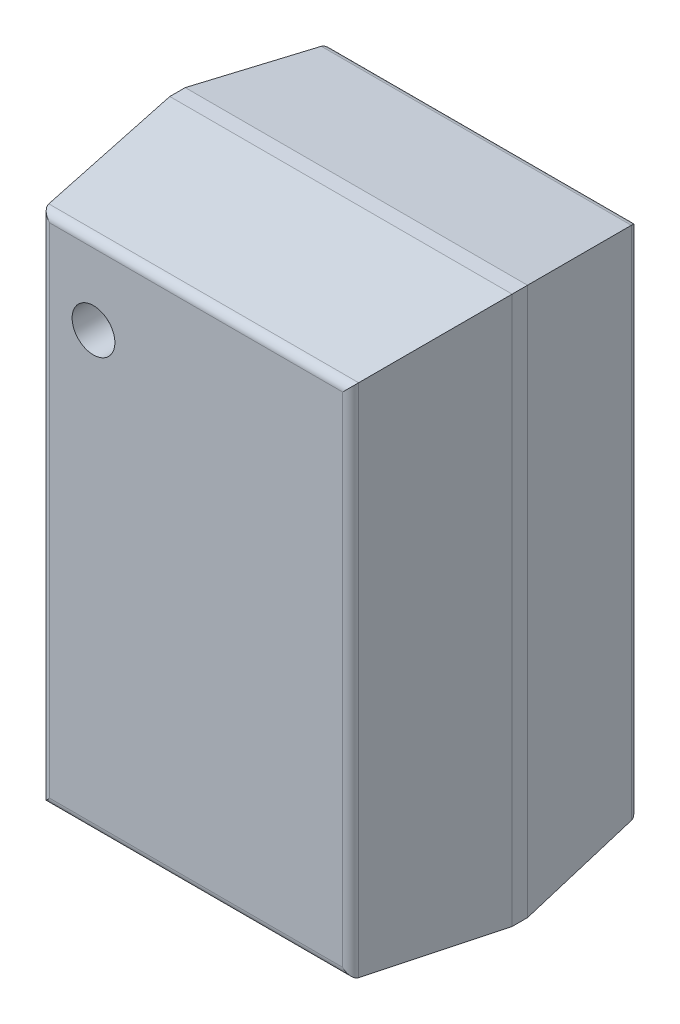
ISO-10303-21;
HEADER;
FILE_DESCRIPTION(('STEP AP214'),'2;1');
FILE_NAME('part.step','',(''),(''),'','','');
FILE_SCHEMA(('AUTOMOTIVE_DESIGN { 1 0 10303 214 1 1 1 1 }'));
ENDSEC;
DATA;
#1=APPLICATION_CONTEXT('core data for automotive mechanical design processes');
#2=APPLICATION_PROTOCOL_DEFINITION('international standard','automotive_design',2000,#1);
#3=PRODUCT_CONTEXT('',#1,'mechanical');
#4=PRODUCT('Part','Part','',(#3));
#5=PRODUCT_RELATED_PRODUCT_CATEGORY('part','',(#4));
#6=PRODUCT_DEFINITION_FORMATION('','',#4);
#7=PRODUCT_DEFINITION_CONTEXT('part definition',#1,'design');
#8=PRODUCT_DEFINITION('design','',#6,#7);
#9=PRODUCT_DEFINITION_SHAPE('','',#8);
#10=(LENGTH_UNIT() NAMED_UNIT(*) SI_UNIT(.MILLI.,.METRE.));
#11=(NAMED_UNIT(*) PLANE_ANGLE_UNIT() SI_UNIT($,.RADIAN.));
#12=(NAMED_UNIT(*) SI_UNIT($,.STERADIAN.) SOLID_ANGLE_UNIT());
#13=UNCERTAINTY_MEASURE_WITH_UNIT(LENGTH_MEASURE(1.E-05),#10,'distance_accuracy_value','');
#14=(GEOMETRIC_REPRESENTATION_CONTEXT(3) GLOBAL_UNCERTAINTY_ASSIGNED_CONTEXT((#13)) GLOBAL_UNIT_ASSIGNED_CONTEXT((#10,
#11,#12)) REPRESENTATION_CONTEXT('',''));
#15=CARTESIAN_POINT('',(0.,0.,0.));
#16=DIRECTION('',(0.,0.,1.));
#17=DIRECTION('',(1.,0.,0.));
#18=AXIS2_PLACEMENT_3D('',#15,#16,#17);
#19=CARTESIAN_POINT('',(-0.375,0.65,0.99));
#20=DIRECTION('',(0.,0.,1.));
#21=DIRECTION('',(1.,0.,0.));
#22=AXIS2_PLACEMENT_3D('',#19,#20,#21);
#23=PLANE('',#22);
#24=CARTESIAN_POINT('',(-0.375,0.65,0.99));
#25=DIRECTION('',(0.,0.,1.));
#26=DIRECTION('',(1.,0.,0.));
#27=AXIS2_PLACEMENT_3D('',#24,#25,#26);
#28=CIRCLE('',#27,0.078125);
#29=CARTESIAN_POINT('',(-0.296875,0.65,0.99));
#30=VERTEX_POINT('',#29);
#31=EDGE_CURVE('E20',#30,#30,#28,.T.);
#32=ORIENTED_EDGE('',*,*,#31,.T.);
#33=EDGE_LOOP('',(#32));
#34=FACE_BOUND('',#33,.T.);
#35=ADVANCED_FACE('F17',(#34),#23,.T.);
#36=CARTESIAN_POINT('',(-0.375,0.65,0.99));
#37=DIRECTION('',(0.,0.,1.));
#38=DIRECTION('',(1.,0.,0.));
#39=AXIS2_PLACEMENT_3D('',#36,#37,#38);
#40=CYLINDRICAL_SURFACE('',#39,0.078125);
#41=CARTESIAN_POINT('',(-0.375,0.65,1.1));
#42=DIRECTION('',(0.,0.,1.));
#43=DIRECTION('',(1.,0.,0.));
#44=AXIS2_PLACEMENT_3D('',#41,#42,#43);
#45=CIRCLE('',#44,0.078125);
#46=CARTESIAN_POINT('',(-0.296875,0.65,1.1));
#47=VERTEX_POINT('',#46);
#48=EDGE_CURVE('E100',#47,#47,#45,.F.);
#49=ORIENTED_EDGE('',*,*,#48,.F.);
#50=EDGE_LOOP('',(#49));
#51=FACE_BOUND('',#50,.T.);
#52=ORIENTED_EDGE('',*,*,#31,.F.);
#53=EDGE_LOOP('',(#52));
#54=FACE_BOUND('',#53,.T.);
#55=ADVANCED_FACE('F496',(#51,#54),#40,.F.);
#56=CARTESIAN_POINT('',(-0.625,-1.,1.1));
#57=DIRECTION('',(0.,0.,1.));
#58=DIRECTION('',(1.,0.,0.));
#59=AXIS2_PLACEMENT_3D('',#56,#57,#58);
#60=PLANE('',#59);
#61=ORIENTED_EDGE('',*,*,#48,.T.);
#62=EDGE_LOOP('',(#61));
#63=FACE_BOUND('',#62,.T.);
#64=DIRECTION('',(0.,1.,0.));
#65=VECTOR('',#64,1.);
#66=CARTESIAN_POINT('',(0.534726594457,-0.9375,1.1));
#67=LINE('',#66,#65);
#68=CARTESIAN_POINT('',(0.534726594457,0.909726594457,1.1));
#69=VERTEX_POINT('',#68);
#70=CARTESIAN_POINT('',(0.534726594457,-0.909726594457,1.1));
#71=VERTEX_POINT('',#70);
#72=EDGE_CURVE('E107',#69,#71,#67,.F.);
#73=ORIENTED_EDGE('',*,*,#72,.F.);
#74=DIRECTION('',(1.,0.,0.));
#75=VECTOR('',#74,1.);
#76=CARTESIAN_POINT('',(-0.625,0.909726594457,1.1));
#77=LINE('',#76,#75);
#78=CARTESIAN_POINT('',(-0.534726594457,0.909726594457,1.1));
#79=VERTEX_POINT('',#78);
#80=EDGE_CURVE('E96',#69,#79,#77,.F.);
#81=ORIENTED_EDGE('',*,*,#80,.T.);
#82=DIRECTION('',(0.,1.,0.));
#83=VECTOR('',#82,1.);
#84=CARTESIAN_POINT('',(-0.534726594457,-0.9375,1.1));
#85=LINE('',#84,#83);
#86=CARTESIAN_POINT('',(-0.534726594457,-0.909726594457,1.1));
#87=VERTEX_POINT('',#86);
#88=EDGE_CURVE('E92',#87,#79,#85,.T.);
#89=ORIENTED_EDGE('',*,*,#88,.F.);
#90=DIRECTION('',(1.,0.,0.));
#91=VECTOR('',#90,1.);
#92=CARTESIAN_POINT('',(-0.5625,-0.909726594457,1.1));
#93=LINE('',#92,#91);
#94=EDGE_CURVE('E81',#71,#87,#93,.F.);
#95=ORIENTED_EDGE('',*,*,#94,.F.);
#96=EDGE_LOOP('',(#73,#81,#89,#95));
#97=FACE_BOUND('',#96,.T.);
#98=ADVANCED_FACE('F95',(#63,#97),#60,.T.);
#99=CARTESIAN_POINT('',(-0.534726594457,-0.9375,1.06875));
#100=DIRECTION('',(0.,1.,0.));
#101=DIRECTION('',(0.,0.,1.));
#102=AXIS2_PLACEMENT_3D('',#99,#100,#101);
#103=CYLINDRICAL_SURFACE('',#102,0.03125);
#104=CARTESIAN_POINT('',(-0.534726594457,0.909726594457,1.06875));
#105=DIRECTION('',(0.707106781186547,0.707106781186547,0.));
#106=DIRECTION('',(0.707106781186547,-0.707106781186547,0.));
#107=AXIS2_PLACEMENT_3D('',#104,#105,#106);
#108=ELLIPSE('',#107,0.0441941738241592,0.03125);
#109=CARTESIAN_POINT('',(-0.565760504091001,0.940760504091001,1.07241864454874));
#110=VERTEX_POINT('',#109);
#111=EDGE_CURVE('E129',#110,#79,#108,.T.);
#112=ORIENTED_EDGE('',*,*,#111,.F.);
#113=DIRECTION('',(0.,1.,0.));
#114=VECTOR('',#113,1.);
#115=CARTESIAN_POINT('',(-0.565760504090913,-1.,1.07241864454899));
#116=LINE('',#115,#114);
#117=CARTESIAN_POINT('',(-0.565760504091001,-0.940760504091001,1.07241864454874));
#118=VERTEX_POINT('',#117);
#119=EDGE_CURVE('E104',#110,#118,#116,.F.);
#120=ORIENTED_EDGE('',*,*,#119,.T.);
#121=CARTESIAN_POINT('',(-0.534726594457,-0.909726594457,1.06875));
#122=DIRECTION('',(0.707106781186547,-0.707106781186547,0.));
#123=DIRECTION('',(0.707106781186547,0.707106781186547,0.));
#124=AXIS2_PLACEMENT_3D('',#121,#122,#123);
#125=ELLIPSE('',#124,0.0441941738241592,0.03125);
#126=EDGE_CURVE('E86',#87,#118,#125,.T.);
#127=ORIENTED_EDGE('',*,*,#126,.F.);
#128=ORIENTED_EDGE('',*,*,#88,.T.);
#129=EDGE_LOOP('',(#112,#120,#127,#128));
#130=FACE_BOUND('',#129,.T.);
#131=ADVANCED_FACE('F103',(#130),#103,.T.);
#132=CARTESIAN_POINT('',(-0.5625,-0.909726594457,1.06875));
#133=DIRECTION('',(1.,0.,0.));
#134=DIRECTION('',(0.,0.,-1.));
#135=AXIS2_PLACEMENT_3D('',#132,#133,#134);
#136=CYLINDRICAL_SURFACE('',#135,0.03125);
#137=ORIENTED_EDGE('',*,*,#94,.T.);
#138=ORIENTED_EDGE('',*,*,#126,.T.);
#139=DIRECTION('',(1.,0.,0.));
#140=VECTOR('',#139,1.);
#141=CARTESIAN_POINT('',(-0.625,-0.940760504090913,1.07241864454899));
#142=LINE('',#141,#140);
#143=CARTESIAN_POINT('',(0.565760504091001,-0.940760504091001,1.07241864454874));
#144=VERTEX_POINT('',#143);
#145=EDGE_CURVE('E141',#118,#144,#142,.T.);
#146=ORIENTED_EDGE('',*,*,#145,.T.);
#147=CARTESIAN_POINT('',(0.534726594457,-0.909726594457,1.06875));
#148=DIRECTION('',(0.707106781186547,0.707106781186547,0.));
#149=DIRECTION('',(-0.707106781186547,0.707106781186547,0.));
#150=AXIS2_PLACEMENT_3D('',#147,#148,#149);
#151=ELLIPSE('',#150,0.0441941738241592,0.03125);
#152=EDGE_CURVE('E88',#71,#144,#151,.T.);
#153=ORIENTED_EDGE('',*,*,#152,.F.);
#154=EDGE_LOOP('',(#137,#138,#146,#153));
#155=FACE_BOUND('',#154,.T.);
#156=ADVANCED_FACE('F83',(#155),#136,.T.);
#157=CARTESIAN_POINT('',(0.534726594457,-0.9375,1.06875));
#158=DIRECTION('',(0.,1.,0.));
#159=DIRECTION('',(0.,0.,1.));
#160=AXIS2_PLACEMENT_3D('',#157,#158,#159);
#161=CYLINDRICAL_SURFACE('',#160,0.03125);
#162=CARTESIAN_POINT('',(0.534726594457,0.909726594457,1.06875));
#163=DIRECTION('',(0.707106781186547,-0.707106781186547,0.));
#164=DIRECTION('',(0.707106781186547,0.707106781186547,0.));
#165=AXIS2_PLACEMENT_3D('',#162,#163,#164);
#166=ELLIPSE('',#165,0.0441941738241592,0.03125);
#167=CARTESIAN_POINT('',(0.565760504091001,0.940760504091001,1.07241864454874));
#168=VERTEX_POINT('',#167);
#169=EDGE_CURVE('E130',#69,#168,#166,.F.);
#170=ORIENTED_EDGE('',*,*,#169,.F.);
#171=ORIENTED_EDGE('',*,*,#72,.T.);
#172=ORIENTED_EDGE('',*,*,#152,.T.);
#173=DIRECTION('',(0.,1.,0.));
#174=VECTOR('',#173,1.);
#175=CARTESIAN_POINT('',(0.565760504090913,-1.,1.07241864454899));
#176=LINE('',#175,#174);
#177=EDGE_CURVE('E139',#168,#144,#176,.F.);
#178=ORIENTED_EDGE('',*,*,#177,.F.);
#179=EDGE_LOOP('',(#170,#171,#172,#178));
#180=FACE_BOUND('',#179,.T.);
#181=ADVANCED_FACE('F463',(#180),#161,.T.);
#182=CARTESIAN_POINT('',(-0.5625,0.909726594457,1.06875));
#183=DIRECTION('',(1.,0.,0.));
#184=DIRECTION('',(0.,0.,-1.));
#185=AXIS2_PLACEMENT_3D('',#182,#183,#184);
#186=CYLINDRICAL_SURFACE('',#185,0.03125);
#187=DIRECTION('',(1.,0.,0.));
#188=VECTOR('',#187,1.);
#189=CARTESIAN_POINT('',(-0.625,0.940760504090913,1.07241864454899));
#190=LINE('',#189,#188);
#191=EDGE_CURVE('E149',#110,#168,#190,.T.);
#192=ORIENTED_EDGE('',*,*,#191,.F.);
#193=ORIENTED_EDGE('',*,*,#111,.T.);
#194=ORIENTED_EDGE('',*,*,#80,.F.);
#195=ORIENTED_EDGE('',*,*,#169,.T.);
#196=EDGE_LOOP('',(#192,#193,#194,#195));
#197=FACE_BOUND('',#196,.T.);
#198=ADVANCED_FACE('F453',(#197),#186,.T.);
#199=CARTESIAN_POINT('',(-0.59375,-1.,0.835649048786));
#200=DIRECTION('',(0.993085108290829,0.,-0.11739662555198));
#201=DIRECTION('',(-0.11739662555198,0.,-0.993085108290829));
#202=AXIS2_PLACEMENT_3D('',#199,#200,#201);
#203=PLANE('',#202);
#204=DIRECTION('',(0.116595914392692,-0.116595914392651,0.986311708079081));
#205=VECTOR('',#204,1.);
#206=CARTESIAN_POINT('',(-0.625,0.999999999999892,0.571298097571987));
#207=LINE('',#206,#205);
#208=CARTESIAN_POINT('',(-0.625,0.999999999999973,0.571298097571997));
#209=VERTEX_POINT('',#208);
#210=EDGE_CURVE('E155',#209,#110,#207,.T.);
#211=ORIENTED_EDGE('',*,*,#210,.F.);
#212=DIRECTION('',(0.,1.,0.));
#213=VECTOR('',#212,1.);
#214=CARTESIAN_POINT('',(-0.625,-1.,0.571298097572));
#215=LINE('',#214,#213);
#216=CARTESIAN_POINT('',(-0.625,-0.999999999999973,0.571298097571997));
#217=VERTEX_POINT('',#216);
#218=EDGE_CURVE('E183',#209,#217,#215,.F.);
#219=ORIENTED_EDGE('',*,*,#218,.T.);
#220=DIRECTION('',(0.116595914392692,0.116595914392651,0.986311708079081));
#221=VECTOR('',#220,1.);
#222=CARTESIAN_POINT('',(-0.625,-0.999999999999892,0.571298097571987));
#223=LINE('',#222,#221);
#224=EDGE_CURVE('E142',#217,#118,#223,.T.);
#225=ORIENTED_EDGE('',*,*,#224,.T.);
#226=ORIENTED_EDGE('',*,*,#119,.F.);
#227=EDGE_LOOP('',(#211,#219,#225,#226));
#228=FACE_BOUND('',#227,.T.);
#229=ADVANCED_FACE('F444',(#228),#203,.F.);
#230=CARTESIAN_POINT('',(-0.625,-0.96875,0.835649048786));
#231=DIRECTION('',(0.,0.993085108290829,-0.11739662555198));
#232=DIRECTION('',(0.,0.11739662555198,0.993085108290829));
#233=AXIS2_PLACEMENT_3D('',#230,#231,#232);
#234=PLANE('',#233);
#235=DIRECTION('',(1.,0.,0.));
#236=VECTOR('',#235,1.);
#237=CARTESIAN_POINT('',(-0.625,-1.,0.571298097572));
#238=LINE('',#237,#236);
#239=CARTESIAN_POINT('',(0.624999999999973,-1.,0.571298097571997));
#240=VERTEX_POINT('',#239);
#241=EDGE_CURVE('E170',#217,#240,#238,.T.);
#242=ORIENTED_EDGE('',*,*,#241,.T.);
#243=DIRECTION('',(0.11659591439265,-0.116595914392692,-0.986311708079081));
#244=VECTOR('',#243,1.);
#245=CARTESIAN_POINT('',(0.565760504090913,-0.940760504091,1.07241864454899));
#246=LINE('',#245,#244);
#247=EDGE_CURVE('E144',#144,#240,#246,.T.);
#248=ORIENTED_EDGE('',*,*,#247,.F.);
#249=ORIENTED_EDGE('',*,*,#145,.F.);
#250=ORIENTED_EDGE('',*,*,#224,.F.);
#251=EDGE_LOOP('',(#242,#248,#249,#250));
#252=FACE_BOUND('',#251,.T.);
#253=ADVANCED_FACE('F435',(#252),#234,.F.);
#254=CARTESIAN_POINT('',(0.59375,-1.,0.835649048786));
#255=DIRECTION('',(0.993085108290829,0.,0.11739662555198));
#256=DIRECTION('',(0.11739662555198,0.,-0.993085108290829));
#257=AXIS2_PLACEMENT_3D('',#254,#255,#256);
#258=PLANE('',#257);
#259=DIRECTION('',(0.116595914392692,0.116595914392651,-0.986311708079081));
#260=VECTOR('',#259,1.);
#261=CARTESIAN_POINT('',(0.565760504091,0.940760504090913,1.07241864454899));
#262=LINE('',#261,#260);
#263=CARTESIAN_POINT('',(0.625,0.999999999999973,0.571298097571997));
#264=VERTEX_POINT('',#263);
#265=EDGE_CURVE('E150',#168,#264,#262,.T.);
#266=ORIENTED_EDGE('',*,*,#265,.F.);
#267=ORIENTED_EDGE('',*,*,#177,.T.);
#268=ORIENTED_EDGE('',*,*,#247,.T.);
#269=DIRECTION('',(0.,1.,0.));
#270=VECTOR('',#269,1.);
#271=CARTESIAN_POINT('',(0.625,-1.,0.571298097572));
#272=LINE('',#271,#270);
#273=EDGE_CURVE('E180',#264,#240,#272,.F.);
#274=ORIENTED_EDGE('',*,*,#273,.F.);
#275=EDGE_LOOP('',(#266,#267,#268,#274));
#276=FACE_BOUND('',#275,.T.);
#277=ADVANCED_FACE('F426',(#276),#258,.T.);
#278=CARTESIAN_POINT('',(-0.625,0.96875,0.835649048786));
#279=DIRECTION('',(0.,0.993085108290829,0.11739662555198));
#280=DIRECTION('',(0.,-0.11739662555198,0.993085108290829));
#281=AXIS2_PLACEMENT_3D('',#278,#279,#280);
#282=PLANE('',#281);
#283=DIRECTION('',(1.,0.,0.));
#284=VECTOR('',#283,1.);
#285=CARTESIAN_POINT('',(-0.625,1.,0.571298097572));
#286=LINE('',#285,#284);
#287=EDGE_CURVE('E202',#209,#264,#286,.T.);
#288=ORIENTED_EDGE('',*,*,#287,.F.);
#289=ORIENTED_EDGE('',*,*,#210,.T.);
#290=ORIENTED_EDGE('',*,*,#191,.T.);
#291=ORIENTED_EDGE('',*,*,#265,.T.);
#292=EDGE_LOOP('',(#288,#289,#290,#291));
#293=FACE_BOUND('',#292,.T.);
#294=ADVANCED_FACE('F417',(#293),#282,.T.);
#295=CARTESIAN_POINT('',(-0.625,-1.,0.05));
#296=DIRECTION('',(1.,0.,0.));
#297=DIRECTION('',(0.,0.,-1.));
#298=AXIS2_PLACEMENT_3D('',#295,#296,#297);
#299=PLANE('',#298);
#300=DIRECTION('',(0.,0.,1.));
#301=VECTOR('',#300,1.);
#302=CARTESIAN_POINT('',(-0.625,1.,0.05));
#303=LINE('',#302,#301);
#304=CARTESIAN_POINT('',(-0.624999999999975,0.999999999999924,0.51504809757201));
#305=VERTEX_POINT('',#304);
#306=EDGE_CURVE('E206',#305,#209,#303,.T.);
#307=ORIENTED_EDGE('',*,*,#306,.F.);
#308=DIRECTION('',(0.,1.,0.));
#309=VECTOR('',#308,1.);
#310=CARTESIAN_POINT('',(-0.624999999999899,-1.,0.515048097572014));
#311=LINE('',#310,#309);
#312=CARTESIAN_POINT('',(-0.624999999999975,-0.999999999999949,0.51504809757201));
#313=VERTEX_POINT('',#312);
#314=EDGE_CURVE('E205',#313,#305,#311,.T.);
#315=ORIENTED_EDGE('',*,*,#314,.F.);
#316=DIRECTION('',(0.,0.,1.));
#317=VECTOR('',#316,1.);
#318=CARTESIAN_POINT('',(-0.625,-1.,0.05));
#319=LINE('',#318,#317);
#320=EDGE_CURVE('E173',#313,#217,#319,.T.);
#321=ORIENTED_EDGE('',*,*,#320,.T.);
#322=ORIENTED_EDGE('',*,*,#218,.F.);
#323=EDGE_LOOP('',(#307,#315,#321,#322));
#324=FACE_BOUND('',#323,.T.);
#325=ADVANCED_FACE('F407',(#324),#299,.F.);
#326=CARTESIAN_POINT('',(-0.625,-1.,0.05));
#327=DIRECTION('',(0.,1.,0.));
#328=DIRECTION('',(0.,0.,1.));
#329=AXIS2_PLACEMENT_3D('',#326,#327,#328);
#330=PLANE('',#329);
#331=ORIENTED_EDGE('',*,*,#320,.F.);
#332=DIRECTION('',(1.,0.,0.));
#333=VECTOR('',#332,1.);
#334=CARTESIAN_POINT('',(-0.625,-0.999999999999899,0.515048097572014));
#335=LINE('',#334,#333);
#336=CARTESIAN_POINT('',(0.624999999999949,-0.999999999999975,0.515048097572014));
#337=VERTEX_POINT('',#336);
#338=EDGE_CURVE('E235',#337,#313,#335,.F.);
#339=ORIENTED_EDGE('',*,*,#338,.F.);
#340=DIRECTION('',(0.,0.,-1.));
#341=VECTOR('',#340,1.);
#342=CARTESIAN_POINT('',(0.625,-1.,0.05));
#343=LINE('',#342,#341);
#344=EDGE_CURVE('E172',#240,#337,#343,.T.);
#345=ORIENTED_EDGE('',*,*,#344,.F.);
#346=ORIENTED_EDGE('',*,*,#241,.F.);
#347=EDGE_LOOP('',(#331,#339,#345,#346));
#348=FACE_BOUND('',#347,.T.);
#349=ADVANCED_FACE('F398',(#348),#330,.F.);
#350=CARTESIAN_POINT('',(0.625,-1.,0.05));
#351=DIRECTION('',(1.,0.,0.));
#352=DIRECTION('',(0.,0.,-1.));
#353=AXIS2_PLACEMENT_3D('',#350,#351,#352);
#354=PLANE('',#353);
#355=DIRECTION('',(0.,0.,1.));
#356=VECTOR('',#355,1.);
#357=CARTESIAN_POINT('',(0.625,1.,0.05));
#358=LINE('',#357,#356);
#359=CARTESIAN_POINT('',(0.624999999999975,0.999999999999949,0.515048097572014));
#360=VERTEX_POINT('',#359);
#361=EDGE_CURVE('E210',#264,#360,#358,.F.);
#362=ORIENTED_EDGE('',*,*,#361,.F.);
#363=ORIENTED_EDGE('',*,*,#273,.T.);
#364=ORIENTED_EDGE('',*,*,#344,.T.);
#365=DIRECTION('',(0.,1.,0.));
#366=VECTOR('',#365,1.);
#367=CARTESIAN_POINT('',(0.624999999999899,-1.,0.515048097572014));
#368=LINE('',#367,#366);
#369=EDGE_CURVE('E228',#337,#360,#368,.T.);
#370=ORIENTED_EDGE('',*,*,#369,.T.);
#371=EDGE_LOOP('',(#362,#363,#364,#370));
#372=FACE_BOUND('',#371,.T.);
#373=ADVANCED_FACE('F389',(#372),#354,.T.);
#374=CARTESIAN_POINT('',(-0.625,1.,0.05));
#375=DIRECTION('',(0.,1.,0.));
#376=DIRECTION('',(0.,0.,1.));
#377=AXIS2_PLACEMENT_3D('',#374,#375,#376);
#378=PLANE('',#377);
#379=ORIENTED_EDGE('',*,*,#306,.T.);
#380=ORIENTED_EDGE('',*,*,#287,.T.);
#381=ORIENTED_EDGE('',*,*,#361,.T.);
#382=DIRECTION('',(1.,0.,0.));
#383=VECTOR('',#382,1.);
#384=CARTESIAN_POINT('',(-0.625,0.999999999999899,0.515048097572014));
#385=LINE('',#384,#383);
#386=EDGE_CURVE('E254',#360,#305,#385,.F.);
#387=ORIENTED_EDGE('',*,*,#386,.T.);
#388=EDGE_LOOP('',(#379,#380,#381,#387));
#389=FACE_BOUND('',#388,.T.);
#390=ADVANCED_FACE('F380',(#389),#378,.T.);
#391=CARTESIAN_POINT('',(-0.59375,-1.,0.282524048786));
#392=DIRECTION('',(-0.991089557006559,0.,-0.133197184626941));
#393=DIRECTION('',(-0.133197184626941,0.,0.991089557006559));
#394=AXIS2_PLACEMENT_3D('',#391,#392,#393);
#395=PLANE('',#394);
#396=DIRECTION('',(0.132031119430744,-0.132031119430208,-0.982413134584361));
#397=VECTOR('',#396,1.);
#398=CARTESIAN_POINT('',(-0.625,0.999999999999899,0.515048097572014));
#399=LINE('',#398,#397);
#400=CARTESIAN_POINT('',(-0.566140428286227,0.941140428286373,0.0770875879803753));
#401=VERTEX_POINT('',#400);
#402=EDGE_CURVE('E256',#305,#401,#399,.T.);
#403=ORIENTED_EDGE('',*,*,#402,.T.);
#404=DIRECTION('',(0.,1.,0.));
#405=VECTOR('',#404,1.);
#406=CARTESIAN_POINT('',(-0.566140428286445,-0.9375,0.0770875879803302));
#407=LINE('',#406,#405);
#408=CARTESIAN_POINT('',(-0.566140428286227,-0.941140428286373,0.0770875879803753));
#409=VERTEX_POINT('',#408);
#410=EDGE_CURVE('E128',#409,#401,#407,.T.);
#411=ORIENTED_EDGE('',*,*,#410,.F.);
#412=DIRECTION('',(0.132031119430744,0.132031119430208,-0.982413134584361));
#413=VECTOR('',#412,1.);
#414=CARTESIAN_POINT('',(-0.625,-0.999999999999899,0.515048097572014));
#415=LINE('',#414,#413);
#416=EDGE_CURVE('E237',#313,#409,#415,.T.);
#417=ORIENTED_EDGE('',*,*,#416,.F.);
#418=ORIENTED_EDGE('',*,*,#314,.T.);
#419=EDGE_LOOP('',(#403,#411,#417,#418));
#420=FACE_BOUND('',#419,.T.);
#421=ADVANCED_FACE('F301',(#420),#395,.T.);
#422=CARTESIAN_POINT('',(-0.625,-0.96875,0.282524048786));
#423=DIRECTION('',(0.,-0.991089557006559,-0.133197184626941));
#424=DIRECTION('',(0.,0.133197184626941,-0.991089557006559));
#425=AXIS2_PLACEMENT_3D('',#422,#423,#424);
#426=PLANE('',#425);
#427=ORIENTED_EDGE('',*,*,#338,.T.);
#428=ORIENTED_EDGE('',*,*,#416,.T.);
#429=DIRECTION('',(1.,0.,0.));
#430=VECTOR('',#429,1.);
#431=CARTESIAN_POINT('',(-0.5625,-0.941140428286445,0.0770875879803302));
#432=LINE('',#431,#430);
#433=CARTESIAN_POINT('',(0.566140428286372,-0.941140428286227,0.0770875879803753));
#434=VERTEX_POINT('',#433);
#435=EDGE_CURVE('E127',#434,#409,#432,.F.);
#436=ORIENTED_EDGE('',*,*,#435,.F.);
#437=DIRECTION('',(0.132031119430208,-0.132031119430744,0.982413134584361));
#438=VECTOR('',#437,1.);
#439=CARTESIAN_POINT('',(0.566140428286138,-0.941140428286,0.0770875879803715));
#440=LINE('',#439,#438);
#441=EDGE_CURVE('E231',#434,#337,#440,.T.);
#442=ORIENTED_EDGE('',*,*,#441,.T.);
#443=EDGE_LOOP('',(#427,#428,#436,#442));
#444=FACE_BOUND('',#443,.T.);
#445=ADVANCED_FACE('F275',(#444),#426,.T.);
#446=CARTESIAN_POINT('',(0.59375,-1.,0.282524048786));
#447=DIRECTION('',(-0.991089557006559,0.,0.133197184626941));
#448=DIRECTION('',(0.133197184626941,0.,0.991089557006559));
#449=AXIS2_PLACEMENT_3D('',#446,#447,#448);
#450=PLANE('',#449);
#451=DIRECTION('',(0.132031119430744,0.132031119430208,0.982413134584361));
#452=VECTOR('',#451,1.);
#453=CARTESIAN_POINT('',(0.566140428286,0.941140428286138,0.0770875879803715));
#454=LINE('',#453,#452);
#455=CARTESIAN_POINT('',(0.566140428286227,0.941140428286373,0.0770875879803753));
#456=VERTEX_POINT('',#455);
#457=EDGE_CURVE('E230',#456,#360,#454,.T.);
#458=ORIENTED_EDGE('',*,*,#457,.T.);
#459=ORIENTED_EDGE('',*,*,#369,.F.);
#460=ORIENTED_EDGE('',*,*,#441,.F.);
#461=DIRECTION('',(0.,1.,0.));
#462=VECTOR('',#461,1.);
#463=CARTESIAN_POINT('',(0.566140428286445,-0.9375,0.0770875879803303));
#464=LINE('',#463,#462);
#465=EDGE_CURVE('E124',#456,#434,#464,.F.);
#466=ORIENTED_EDGE('',*,*,#465,.F.);
#467=EDGE_LOOP('',(#458,#459,#460,#466));
#468=FACE_BOUND('',#467,.T.);
#469=ADVANCED_FACE('F280',(#468),#450,.F.);
#470=CARTESIAN_POINT('',(-0.625,0.96875,0.282524048786));
#471=DIRECTION('',(0.,-0.991089557006559,0.133197184626941));
#472=DIRECTION('',(0.,-0.133197184626941,-0.991089557006559));
#473=AXIS2_PLACEMENT_3D('',#470,#471,#472);
#474=PLANE('',#473);
#475=ORIENTED_EDGE('',*,*,#386,.F.);
#476=ORIENTED_EDGE('',*,*,#457,.F.);
#477=DIRECTION('',(1.,0.,0.));
#478=VECTOR('',#477,1.);
#479=CARTESIAN_POINT('',(-0.5625,0.941140428286445,0.0770875879803303));
#480=LINE('',#479,#478);
#481=EDGE_CURVE('E118',#401,#456,#480,.T.);
#482=ORIENTED_EDGE('',*,*,#481,.F.);
#483=ORIENTED_EDGE('',*,*,#402,.F.);
#484=EDGE_LOOP('',(#475,#476,#482,#483));
#485=FACE_BOUND('',#484,.T.);
#486=ADVANCED_FACE('F303',(#485),#474,.F.);
#487=CARTESIAN_POINT('',(-0.53516887963,-0.9375,0.08125));
#488=DIRECTION('',(0.,1.,0.));
#489=DIRECTION('',(0.,0.,1.));
#490=AXIS2_PLACEMENT_3D('',#487,#488,#489);
#491=CYLINDRICAL_SURFACE('',#490,0.03125);
#492=DIRECTION('',(0.,1.,0.));
#493=VECTOR('',#492,1.);
#494=CARTESIAN_POINT('',(-0.53516887963,-1.,0.05));
#495=LINE('',#494,#493);
#496=CARTESIAN_POINT('',(-0.53516887963,0.91016887963,0.05));
#497=VERTEX_POINT('',#496);
#498=CARTESIAN_POINT('',(-0.53516887963,-0.91016887963,0.05));
#499=VERTEX_POINT('',#498);
#500=EDGE_CURVE('E117',#497,#499,#495,.F.);
#501=ORIENTED_EDGE('',*,*,#500,.T.);
#502=CARTESIAN_POINT('',(-0.53516887963,-0.91016887963,0.08125));
#503=DIRECTION('',(0.707106781186547,-0.707106781186547,0.));
#504=DIRECTION('',(0.707106781186547,0.707106781186547,0.));
#505=AXIS2_PLACEMENT_3D('',#502,#503,#504);
#506=ELLIPSE('',#505,0.0441941738241592,0.03125);
#507=EDGE_CURVE('E125',#409,#499,#506,.T.);
#508=ORIENTED_EDGE('',*,*,#507,.F.);
#509=ORIENTED_EDGE('',*,*,#410,.T.);
#510=CARTESIAN_POINT('',(-0.53516887963,0.91016887963,0.08125));
#511=DIRECTION('',(0.707106781186547,0.707106781186547,0.));
#512=DIRECTION('',(0.707106781186547,-0.707106781186547,0.));
#513=AXIS2_PLACEMENT_3D('',#510,#511,#512);
#514=ELLIPSE('',#513,0.0441941738241592,0.03125);
#515=EDGE_CURVE('E119',#497,#401,#514,.T.);
#516=ORIENTED_EDGE('',*,*,#515,.F.);
#517=EDGE_LOOP('',(#501,#508,#509,#516));
#518=FACE_BOUND('',#517,.T.);
#519=ADVANCED_FACE('F297',(#518),#491,.T.);
#520=CARTESIAN_POINT('',(-0.5625,-0.91016887963,0.08125));
#521=DIRECTION('',(1.,0.,0.));
#522=DIRECTION('',(0.,0.,-1.));
#523=AXIS2_PLACEMENT_3D('',#520,#521,#522);
#524=CYLINDRICAL_SURFACE('',#523,0.03125);
#525=CARTESIAN_POINT('',(0.53516887963,-0.91016887963,0.08125));
#526=DIRECTION('',(0.707106781186547,0.707106781186547,0.));
#527=DIRECTION('',(-0.707106781186547,0.707106781186547,0.));
#528=AXIS2_PLACEMENT_3D('',#525,#526,#527);
#529=ELLIPSE('',#528,0.0441941738241592,0.03125);
#530=CARTESIAN_POINT('',(0.53516887963,-0.91016887963,0.05));
#531=VERTEX_POINT('',#530);
#532=EDGE_CURVE('E122',#434,#531,#529,.T.);
#533=ORIENTED_EDGE('',*,*,#532,.F.);
#534=ORIENTED_EDGE('',*,*,#435,.T.);
#535=ORIENTED_EDGE('',*,*,#507,.T.);
#536=DIRECTION('',(1.,0.,0.));
#537=VECTOR('',#536,1.);
#538=CARTESIAN_POINT('',(-0.625,-0.91016887963,0.05));
#539=LINE('',#538,#537);
#540=EDGE_CURVE('E289',#499,#531,#539,.T.);
#541=ORIENTED_EDGE('',*,*,#540,.T.);
#542=EDGE_LOOP('',(#533,#534,#535,#541));
#543=FACE_BOUND('',#542,.T.);
#544=ADVANCED_FACE('F310',(#543),#524,.T.);
#545=CARTESIAN_POINT('',(0.53516887963,-0.9375,0.08125));
#546=DIRECTION('',(0.,1.,0.));
#547=DIRECTION('',(0.,0.,1.));
#548=AXIS2_PLACEMENT_3D('',#545,#546,#547);
#549=CYLINDRICAL_SURFACE('',#548,0.03125);
#550=ORIENTED_EDGE('',*,*,#465,.T.);
#551=ORIENTED_EDGE('',*,*,#532,.T.);
#552=DIRECTION('',(0.,1.,0.));
#553=VECTOR('',#552,1.);
#554=CARTESIAN_POINT('',(0.53516887963,-1.,0.05));
#555=LINE('',#554,#553);
#556=CARTESIAN_POINT('',(0.53516887963,0.91016887963,0.05));
#557=VERTEX_POINT('',#556);
#558=EDGE_CURVE('E26',#531,#557,#555,.T.);
#559=ORIENTED_EDGE('',*,*,#558,.T.);
#560=CARTESIAN_POINT('',(0.53516887963,0.91016887963,0.08125));
#561=DIRECTION('',(0.707106781186547,-0.707106781186547,0.));
#562=DIRECTION('',(0.707106781186547,0.707106781186547,0.));
#563=AXIS2_PLACEMENT_3D('',#560,#561,#562);
#564=ELLIPSE('',#563,0.0441941738241592,0.03125);
#565=EDGE_CURVE('E34',#456,#557,#564,.F.);
#566=ORIENTED_EDGE('',*,*,#565,.F.);
#567=EDGE_LOOP('',(#550,#551,#559,#566));
#568=FACE_BOUND('',#567,.T.);
#569=ADVANCED_FACE('F282',(#568),#549,.T.);
#570=CARTESIAN_POINT('',(-0.5625,0.91016887963,0.08125));
#571=DIRECTION('',(1.,0.,0.));
#572=DIRECTION('',(0.,0.,-1.));
#573=AXIS2_PLACEMENT_3D('',#570,#571,#572);
#574=CYLINDRICAL_SURFACE('',#573,0.03125);
#575=ORIENTED_EDGE('',*,*,#565,.T.);
#576=DIRECTION('',(1.,0.,0.));
#577=VECTOR('',#576,1.);
#578=CARTESIAN_POINT('',(-0.625,0.91016887963,0.05));
#579=LINE('',#578,#577);
#580=EDGE_CURVE('E11',#557,#497,#579,.F.);
#581=ORIENTED_EDGE('',*,*,#580,.T.);
#582=ORIENTED_EDGE('',*,*,#515,.T.);
#583=ORIENTED_EDGE('',*,*,#481,.T.);
#584=EDGE_LOOP('',(#575,#581,#582,#583));
#585=FACE_BOUND('',#584,.T.);
#586=ADVANCED_FACE('F298',(#585),#574,.T.);
#587=CARTESIAN_POINT('',(-0.625,-1.,0.05));
#588=DIRECTION('',(0.,0.,1.));
#589=DIRECTION('',(1.,0.,0.));
#590=AXIS2_PLACEMENT_3D('',#587,#588,#589);
#591=PLANE('',#590);
#592=ORIENTED_EDGE('',*,*,#558,.F.);
#593=ORIENTED_EDGE('',*,*,#540,.F.);
#594=ORIENTED_EDGE('',*,*,#500,.F.);
#595=ORIENTED_EDGE('',*,*,#580,.F.);
#596=EDGE_LOOP('',(#592,#593,#594,#595));
#597=FACE_BOUND('',#596,.T.);
#598=ADVANCED_FACE('F308',(#597),#591,.F.);
#599=CLOSED_SHELL('',(#35,#55,#98,#131,#156,#181,#198,#229,#253,#277,#294,#325,#349,#373,#390,
#421,#445,#469,#486,#519,#544,#569,#586,#598));
#600=MANIFOLD_SOLID_BREP('B1',#599);
#601=ADVANCED_BREP_SHAPE_REPRESENTATION('',(#18,#600),#14);
#602=SHAPE_DEFINITION_REPRESENTATION(#9,#601);
ENDSEC;
END-ISO-10303-21;
